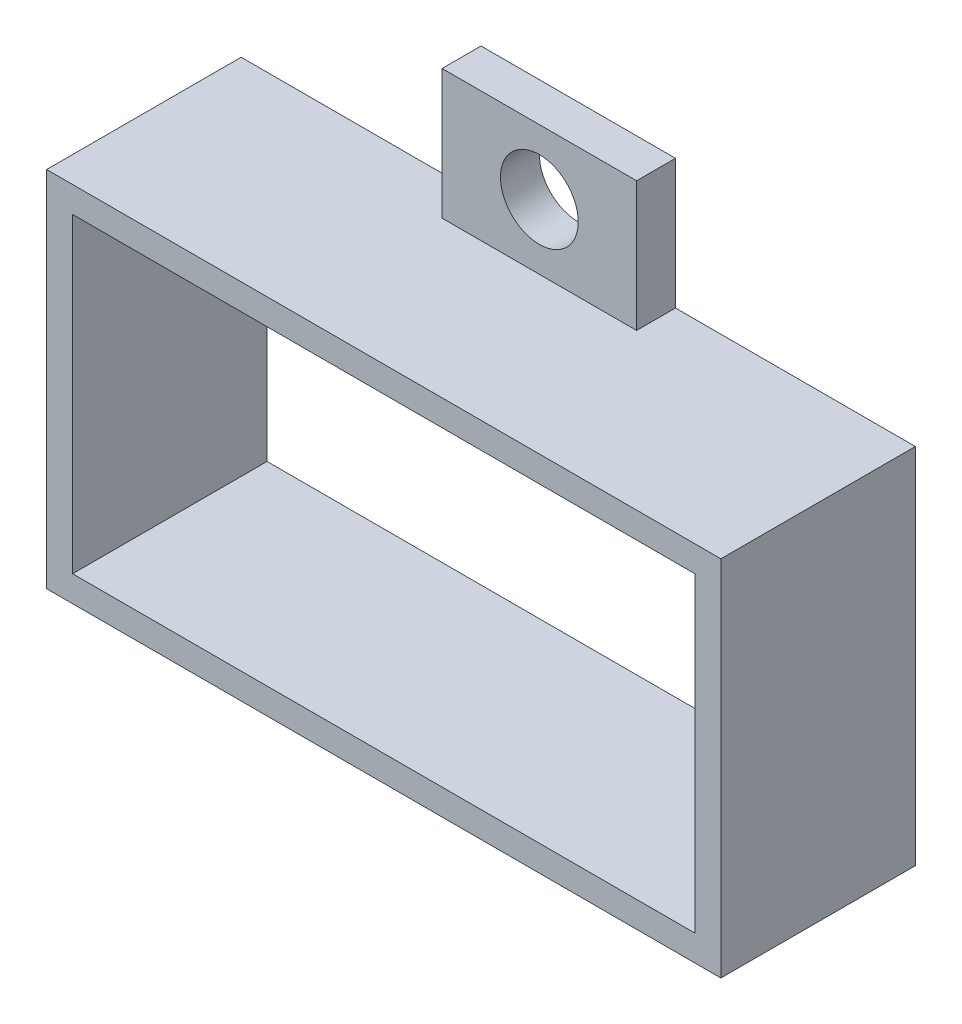
ISO-10303-21;
HEADER;
FILE_DESCRIPTION(('STEP AP214'),'2;1');
FILE_NAME('part.step','',(''),(''),'','','');
FILE_SCHEMA(('AUTOMOTIVE_DESIGN { 1 0 10303 214 1 1 1 1 }'));
ENDSEC;
DATA;
#1=APPLICATION_CONTEXT('core data for automotive mechanical design processes');
#2=APPLICATION_PROTOCOL_DEFINITION('international standard','automotive_design',2000,#1);
#3=PRODUCT_CONTEXT('',#1,'mechanical');
#4=PRODUCT('Part','Part','',(#3));
#5=PRODUCT_RELATED_PRODUCT_CATEGORY('part','',(#4));
#6=PRODUCT_DEFINITION_FORMATION('','',#4);
#7=PRODUCT_DEFINITION_CONTEXT('part definition',#1,'design');
#8=PRODUCT_DEFINITION('design','',#6,#7);
#9=PRODUCT_DEFINITION_SHAPE('','',#8);
#10=(LENGTH_UNIT() NAMED_UNIT(*) SI_UNIT(.MILLI.,.METRE.));
#11=(NAMED_UNIT(*) PLANE_ANGLE_UNIT() SI_UNIT($,.RADIAN.));
#12=(NAMED_UNIT(*) SI_UNIT($,.STERADIAN.) SOLID_ANGLE_UNIT());
#13=UNCERTAINTY_MEASURE_WITH_UNIT(LENGTH_MEASURE(1.E-05),#10,'distance_accuracy_value','');
#14=(GEOMETRIC_REPRESENTATION_CONTEXT(3) GLOBAL_UNCERTAINTY_ASSIGNED_CONTEXT((#13)) GLOBAL_UNIT_ASSIGNED_CONTEXT((#10,
#11,#12)) REPRESENTATION_CONTEXT('',''));
#15=CARTESIAN_POINT('',(0.,0.,0.));
#16=DIRECTION('',(0.,0.,1.));
#17=DIRECTION('',(1.,0.,0.));
#18=AXIS2_PLACEMENT_3D('',#15,#16,#17);
#19=CARTESIAN_POINT('',(-26.,14.,15.));
#20=DIRECTION('',(0.,-1.,0.));
#21=DIRECTION('',(0.,0.,-1.));
#22=AXIS2_PLACEMENT_3D('',#19,#20,#21);
#23=PLANE('',#22);
#24=DIRECTION('',(0.,0.,1.));
#25=VECTOR('',#24,1.);
#26=CARTESIAN_POINT('',(-7.5,14.,0.));
#27=LINE('',#26,#25);
#28=CARTESIAN_POINT('',(-7.50000000000001,14.,0.));
#29=VERTEX_POINT('',#28);
#30=CARTESIAN_POINT('',(-7.5,14.,3.));
#31=VERTEX_POINT('',#30);
#32=EDGE_CURVE('E194',#29,#31,#27,.T.);
#33=ORIENTED_EDGE('',*,*,#32,.F.);
#34=DIRECTION('',(-1.,0.,0.));
#35=VECTOR('',#34,1.);
#36=CARTESIAN_POINT('',(-26.,14.,0.));
#37=LINE('',#36,#35);
#38=CARTESIAN_POINT('',(-26.,14.,0.));
#39=VERTEX_POINT('',#38);
#40=EDGE_CURVE('E266',#29,#39,#37,.T.);
#41=ORIENTED_EDGE('',*,*,#40,.T.);
#42=DIRECTION('',(0.,0.,-1.));
#43=VECTOR('',#42,1.);
#44=CARTESIAN_POINT('',(-26.,14.,15.));
#45=LINE('',#44,#43);
#46=CARTESIAN_POINT('',(-26.,14.,15.));
#47=VERTEX_POINT('',#46);
#48=EDGE_CURVE('E40',#47,#39,#45,.T.);
#49=ORIENTED_EDGE('',*,*,#48,.F.);
#50=DIRECTION('',(-1.,0.,0.));
#51=VECTOR('',#50,1.);
#52=CARTESIAN_POINT('',(-26.,14.,15.));
#53=LINE('',#52,#51);
#54=CARTESIAN_POINT('',(26.,14.,15.));
#55=VERTEX_POINT('',#54);
#56=EDGE_CURVE('E256',#55,#47,#53,.T.);
#57=ORIENTED_EDGE('',*,*,#56,.F.);
#58=DIRECTION('',(0.,0.,-1.));
#59=VECTOR('',#58,1.);
#60=CARTESIAN_POINT('',(26.,14.,15.));
#61=LINE('',#60,#59);
#62=CARTESIAN_POINT('',(26.,14.,0.));
#63=VERTEX_POINT('',#62);
#64=EDGE_CURVE('E11',#55,#63,#61,.T.);
#65=ORIENTED_EDGE('',*,*,#64,.T.);
#66=CARTESIAN_POINT('',(7.49999999999999,14.,0.));
#67=VERTEX_POINT('',#66);
#68=EDGE_CURVE('E267',#63,#67,#37,.T.);
#69=ORIENTED_EDGE('',*,*,#68,.T.);
#70=DIRECTION('',(0.,0.,-1.));
#71=VECTOR('',#70,1.);
#72=CARTESIAN_POINT('',(7.5,14.,0.));
#73=LINE('',#72,#71);
#74=CARTESIAN_POINT('',(7.5,14.,3.));
#75=VERTEX_POINT('',#74);
#76=EDGE_CURVE('E199',#75,#67,#73,.T.);
#77=ORIENTED_EDGE('',*,*,#76,.F.);
#78=DIRECTION('',(1.,0.,0.));
#79=VECTOR('',#78,1.);
#80=CARTESIAN_POINT('',(-7.5,14.,3.));
#81=LINE('',#80,#79);
#82=EDGE_CURVE('E55',#31,#75,#81,.T.);
#83=ORIENTED_EDGE('',*,*,#82,.F.);
#84=EDGE_LOOP('',(#33,#41,#49,#57,#65,#69,#77,#83));
#85=FACE_BOUND('',#84,.T.);
#86=ADVANCED_FACE('F32',(#85),#23,.F.);
#87=CARTESIAN_POINT('',(0.,0.,15.));
#88=DIRECTION('',(0.,0.,1.));
#89=DIRECTION('',(1.,0.,0.));
#90=AXIS2_PLACEMENT_3D('',#87,#88,#89);
#91=PLANE('',#90);
#92=DIRECTION('',(0.,1.,0.));
#93=VECTOR('',#92,1.);
#94=CARTESIAN_POINT('',(26.,14.,15.));
#95=LINE('',#94,#93);
#96=CARTESIAN_POINT('',(26.,-14.,15.));
#97=VERTEX_POINT('',#96);
#98=EDGE_CURVE('E253',#97,#55,#95,.T.);
#99=ORIENTED_EDGE('',*,*,#98,.T.);
#100=ORIENTED_EDGE('',*,*,#56,.T.);
#101=DIRECTION('',(0.,-1.,0.));
#102=VECTOR('',#101,1.);
#103=CARTESIAN_POINT('',(-26.,14.,15.));
#104=LINE('',#103,#102);
#105=CARTESIAN_POINT('',(-26.,-14.,15.));
#106=VERTEX_POINT('',#105);
#107=EDGE_CURVE('E259',#47,#106,#104,.T.);
#108=ORIENTED_EDGE('',*,*,#107,.T.);
#109=DIRECTION('',(1.,0.,0.));
#110=VECTOR('',#109,1.);
#111=CARTESIAN_POINT('',(-26.,-14.,15.));
#112=LINE('',#111,#110);
#113=EDGE_CURVE('E261',#106,#97,#112,.T.);
#114=ORIENTED_EDGE('',*,*,#113,.T.);
#115=EDGE_LOOP('',(#99,#100,#108,#114));
#116=FACE_BOUND('',#115,.T.);
#117=DIRECTION('',(-1.,0.,0.));
#118=VECTOR('',#117,1.);
#119=CARTESIAN_POINT('',(-24.,12.,15.));
#120=LINE('',#119,#118);
#121=CARTESIAN_POINT('',(24.,12.,15.));
#122=VERTEX_POINT('',#121);
#123=CARTESIAN_POINT('',(-24.,12.,15.));
#124=VERTEX_POINT('',#123);
#125=EDGE_CURVE('E224',#122,#124,#120,.T.);
#126=ORIENTED_EDGE('',*,*,#125,.F.);
#127=DIRECTION('',(0.,1.,0.));
#128=VECTOR('',#127,1.);
#129=CARTESIAN_POINT('',(24.,12.,15.));
#130=LINE('',#129,#128);
#131=CARTESIAN_POINT('',(24.,-12.,15.));
#132=VERTEX_POINT('',#131);
#133=EDGE_CURVE('E222',#132,#122,#130,.T.);
#134=ORIENTED_EDGE('',*,*,#133,.F.);
#135=DIRECTION('',(1.,0.,0.));
#136=VECTOR('',#135,1.);
#137=CARTESIAN_POINT('',(-24.,-12.,15.));
#138=LINE('',#137,#136);
#139=CARTESIAN_POINT('',(-24.,-12.,15.));
#140=VERTEX_POINT('',#139);
#141=EDGE_CURVE('E230',#140,#132,#138,.T.);
#142=ORIENTED_EDGE('',*,*,#141,.F.);
#143=DIRECTION('',(0.,-1.,0.));
#144=VECTOR('',#143,1.);
#145=CARTESIAN_POINT('',(-24.,12.,15.));
#146=LINE('',#145,#144);
#147=EDGE_CURVE('E227',#124,#140,#146,.T.);
#148=ORIENTED_EDGE('',*,*,#147,.F.);
#149=EDGE_LOOP('',(#126,#134,#142,#148));
#150=FACE_BOUND('',#149,.T.);
#151=ADVANCED_FACE('F292',(#116,#150),#91,.T.);
#152=CARTESIAN_POINT('',(0.,0.,0.));
#153=DIRECTION('',(0.,0.,1.));
#154=DIRECTION('',(1.,0.,0.));
#155=AXIS2_PLACEMENT_3D('',#152,#153,#154);
#156=PLANE('',#155);
#157=CARTESIAN_POINT('',(0.,-19.,0.));
#158=DIRECTION('',(0.,0.,1.));
#159=DIRECTION('',(1.,0.,0.));
#160=AXIS2_PLACEMENT_3D('',#157,#158,#159);
#161=CIRCLE('',#160,3.);
#162=CARTESIAN_POINT('',(3.,-19.,0.));
#163=VERTEX_POINT('',#162);
#164=EDGE_CURVE('E181',#163,#163,#161,.F.);
#165=ORIENTED_EDGE('',*,*,#164,.F.);
#166=EDGE_LOOP('',(#165));
#167=FACE_BOUND('',#166,.T.);
#168=CARTESIAN_POINT('',(0.,19.,0.));
#169=DIRECTION('',(0.,0.,1.));
#170=DIRECTION('',(1.,0.,0.));
#171=AXIS2_PLACEMENT_3D('',#168,#169,#170);
#172=CIRCLE('',#171,3.);
#173=CARTESIAN_POINT('',(3.,19.,0.));
#174=VERTEX_POINT('',#173);
#175=EDGE_CURVE('E191',#174,#174,#172,.T.);
#176=ORIENTED_EDGE('',*,*,#175,.T.);
#177=EDGE_LOOP('',(#176));
#178=FACE_BOUND('',#177,.T.);
#179=DIRECTION('',(0.,1.,0.));
#180=VECTOR('',#179,1.);
#181=CARTESIAN_POINT('',(26.,14.,0.));
#182=LINE('',#181,#180);
#183=CARTESIAN_POINT('',(26.,-14.,0.));
#184=VERTEX_POINT('',#183);
#185=EDGE_CURVE('E252',#184,#63,#182,.T.);
#186=ORIENTED_EDGE('',*,*,#185,.F.);
#187=DIRECTION('',(1.,0.,0.));
#188=VECTOR('',#187,1.);
#189=CARTESIAN_POINT('',(-26.,-14.,0.));
#190=LINE('',#189,#188);
#191=CARTESIAN_POINT('',(7.49999999999999,-14.,0.));
#192=VERTEX_POINT('',#191);
#193=EDGE_CURVE('E271',#192,#184,#190,.T.);
#194=ORIENTED_EDGE('',*,*,#193,.F.);
#195=DIRECTION('',(0.,1.,0.));
#196=VECTOR('',#195,1.);
#197=CARTESIAN_POINT('',(7.5,-24.,0.));
#198=LINE('',#197,#196);
#199=CARTESIAN_POINT('',(7.5,-24.,0.));
#200=VERTEX_POINT('',#199);
#201=EDGE_CURVE('E47',#200,#192,#198,.T.);
#202=ORIENTED_EDGE('',*,*,#201,.F.);
#203=DIRECTION('',(-1.,0.,0.));
#204=VECTOR('',#203,1.);
#205=CARTESIAN_POINT('',(-7.5,-24.,0.));
#206=LINE('',#205,#204);
#207=CARTESIAN_POINT('',(-7.5,-24.,0.));
#208=VERTEX_POINT('',#207);
#209=EDGE_CURVE('E163',#200,#208,#206,.T.);
#210=ORIENTED_EDGE('',*,*,#209,.T.);
#211=DIRECTION('',(0.,1.,0.));
#212=VECTOR('',#211,1.);
#213=CARTESIAN_POINT('',(-7.5,-24.,0.));
#214=LINE('',#213,#212);
#215=CARTESIAN_POINT('',(-7.5,-14.,0.));
#216=VERTEX_POINT('',#215);
#217=EDGE_CURVE('E146',#208,#216,#214,.T.);
#218=ORIENTED_EDGE('',*,*,#217,.T.);
#219=CARTESIAN_POINT('',(-26.,-14.,0.));
#220=VERTEX_POINT('',#219);
#221=EDGE_CURVE('E257',#220,#216,#190,.T.);
#222=ORIENTED_EDGE('',*,*,#221,.F.);
#223=DIRECTION('',(0.,-1.,0.));
#224=VECTOR('',#223,1.);
#225=CARTESIAN_POINT('',(-26.,14.,0.));
#226=LINE('',#225,#224);
#227=EDGE_CURVE('E269',#39,#220,#226,.T.);
#228=ORIENTED_EDGE('',*,*,#227,.F.);
#229=ORIENTED_EDGE('',*,*,#40,.F.);
#230=DIRECTION('',(0.,-1.,0.));
#231=VECTOR('',#230,1.);
#232=CARTESIAN_POINT('',(-7.5,24.,0.));
#233=LINE('',#232,#231);
#234=CARTESIAN_POINT('',(-7.5,24.,0.));
#235=VERTEX_POINT('',#234);
#236=EDGE_CURVE('E205',#235,#29,#233,.T.);
#237=ORIENTED_EDGE('',*,*,#236,.F.);
#238=DIRECTION('',(-1.,0.,0.));
#239=VECTOR('',#238,1.);
#240=CARTESIAN_POINT('',(-7.5,24.,0.));
#241=LINE('',#240,#239);
#242=CARTESIAN_POINT('',(7.5,24.,0.));
#243=VERTEX_POINT('',#242);
#244=EDGE_CURVE('E203',#243,#235,#241,.T.);
#245=ORIENTED_EDGE('',*,*,#244,.F.);
#246=DIRECTION('',(0.,-1.,0.));
#247=VECTOR('',#246,1.);
#248=CARTESIAN_POINT('',(7.5,24.,0.));
#249=LINE('',#248,#247);
#250=EDGE_CURVE('E213',#243,#67,#249,.T.);
#251=ORIENTED_EDGE('',*,*,#250,.T.);
#252=ORIENTED_EDGE('',*,*,#68,.F.);
#253=EDGE_LOOP('',(#186,#194,#202,#210,#218,#222,#228,#229,#237,#245,#251,#252));
#254=FACE_BOUND('',#253,.T.);
#255=DIRECTION('',(0.,1.,0.));
#256=VECTOR('',#255,1.);
#257=CARTESIAN_POINT('',(24.,12.,0.));
#258=LINE('',#257,#256);
#259=CARTESIAN_POINT('',(24.,-12.,0.));
#260=VERTEX_POINT('',#259);
#261=CARTESIAN_POINT('',(24.,12.,0.));
#262=VERTEX_POINT('',#261);
#263=EDGE_CURVE('E221',#260,#262,#258,.T.);
#264=ORIENTED_EDGE('',*,*,#263,.T.);
#265=DIRECTION('',(-1.,0.,0.));
#266=VECTOR('',#265,1.);
#267=CARTESIAN_POINT('',(-24.,12.,0.));
#268=LINE('',#267,#266);
#269=CARTESIAN_POINT('',(-24.,12.,0.));
#270=VERTEX_POINT('',#269);
#271=EDGE_CURVE('E235',#262,#270,#268,.T.);
#272=ORIENTED_EDGE('',*,*,#271,.T.);
#273=DIRECTION('',(0.,-1.,0.));
#274=VECTOR('',#273,1.);
#275=CARTESIAN_POINT('',(-24.,12.,0.));
#276=LINE('',#275,#274);
#277=CARTESIAN_POINT('',(-24.,-12.,0.));
#278=VERTEX_POINT('',#277);
#279=EDGE_CURVE('E238',#270,#278,#276,.T.);
#280=ORIENTED_EDGE('',*,*,#279,.T.);
#281=DIRECTION('',(1.,0.,0.));
#282=VECTOR('',#281,1.);
#283=CARTESIAN_POINT('',(-24.,-12.,0.));
#284=LINE('',#283,#282);
#285=EDGE_CURVE('E225',#278,#260,#284,.T.);
#286=ORIENTED_EDGE('',*,*,#285,.T.);
#287=EDGE_LOOP('',(#264,#272,#280,#286));
#288=FACE_BOUND('',#287,.T.);
#289=ADVANCED_FACE('F169',(#167,#178,#254,#288),#156,.F.);
#290=CARTESIAN_POINT('',(26.,14.,15.));
#291=DIRECTION('',(-1.,0.,0.));
#292=DIRECTION('',(0.,-1.,0.));
#293=AXIS2_PLACEMENT_3D('',#290,#291,#292);
#294=PLANE('',#293);
#295=ORIENTED_EDGE('',*,*,#185,.T.);
#296=ORIENTED_EDGE('',*,*,#64,.F.);
#297=ORIENTED_EDGE('',*,*,#98,.F.);
#298=DIRECTION('',(0.,0.,-1.));
#299=VECTOR('',#298,1.);
#300=CARTESIAN_POINT('',(26.,-14.,15.));
#301=LINE('',#300,#299);
#302=EDGE_CURVE('E263',#97,#184,#301,.T.);
#303=ORIENTED_EDGE('',*,*,#302,.T.);
#304=EDGE_LOOP('',(#295,#296,#297,#303));
#305=FACE_BOUND('',#304,.T.);
#306=ADVANCED_FACE('F34',(#305),#294,.F.);
#307=CARTESIAN_POINT('',(-26.,14.,15.));
#308=DIRECTION('',(1.,0.,0.));
#309=DIRECTION('',(0.,1.,0.));
#310=AXIS2_PLACEMENT_3D('',#307,#308,#309);
#311=PLANE('',#310);
#312=ORIENTED_EDGE('',*,*,#227,.T.);
#313=DIRECTION('',(0.,0.,-1.));
#314=VECTOR('',#313,1.);
#315=CARTESIAN_POINT('',(-26.,-14.,15.));
#316=LINE('',#315,#314);
#317=EDGE_CURVE('E275',#106,#220,#316,.T.);
#318=ORIENTED_EDGE('',*,*,#317,.F.);
#319=ORIENTED_EDGE('',*,*,#107,.F.);
#320=ORIENTED_EDGE('',*,*,#48,.T.);
#321=EDGE_LOOP('',(#312,#318,#319,#320));
#322=FACE_BOUND('',#321,.T.);
#323=ADVANCED_FACE('F282',(#322),#311,.F.);
#324=CARTESIAN_POINT('',(-26.,-14.,15.));
#325=DIRECTION('',(0.,1.,0.));
#326=DIRECTION('',(0.,0.,1.));
#327=AXIS2_PLACEMENT_3D('',#324,#325,#326);
#328=PLANE('',#327);
#329=ORIENTED_EDGE('',*,*,#221,.T.);
#330=DIRECTION('',(0.,0.,1.));
#331=VECTOR('',#330,1.);
#332=CARTESIAN_POINT('',(-7.5,-14.,0.));
#333=LINE('',#332,#331);
#334=CARTESIAN_POINT('',(-7.5,-14.,3.));
#335=VERTEX_POINT('',#334);
#336=EDGE_CURVE('E152',#216,#335,#333,.T.);
#337=ORIENTED_EDGE('',*,*,#336,.T.);
#338=DIRECTION('',(1.,0.,0.));
#339=VECTOR('',#338,1.);
#340=CARTESIAN_POINT('',(-7.5,-14.,3.));
#341=LINE('',#340,#339);
#342=CARTESIAN_POINT('',(7.5,-14.,3.));
#343=VERTEX_POINT('',#342);
#344=EDGE_CURVE('E166',#335,#343,#341,.T.);
#345=ORIENTED_EDGE('',*,*,#344,.T.);
#346=DIRECTION('',(0.,0.,-1.));
#347=VECTOR('',#346,1.);
#348=CARTESIAN_POINT('',(7.5,-14.,0.));
#349=LINE('',#348,#347);
#350=EDGE_CURVE('E180',#343,#192,#349,.T.);
#351=ORIENTED_EDGE('',*,*,#350,.T.);
#352=ORIENTED_EDGE('',*,*,#193,.T.);
#353=ORIENTED_EDGE('',*,*,#302,.F.);
#354=ORIENTED_EDGE('',*,*,#113,.F.);
#355=ORIENTED_EDGE('',*,*,#317,.T.);
#356=EDGE_LOOP('',(#329,#337,#345,#351,#352,#353,#354,#355));
#357=FACE_BOUND('',#356,.T.);
#358=ADVANCED_FACE('F287',(#357),#328,.F.);
#359=CARTESIAN_POINT('',(24.,12.,15.));
#360=DIRECTION('',(-1.,0.,0.));
#361=DIRECTION('',(0.,-1.,0.));
#362=AXIS2_PLACEMENT_3D('',#359,#360,#361);
#363=PLANE('',#362);
#364=ORIENTED_EDGE('',*,*,#263,.F.);
#365=DIRECTION('',(0.,0.,-1.));
#366=VECTOR('',#365,1.);
#367=CARTESIAN_POINT('',(24.,-12.,15.));
#368=LINE('',#367,#366);
#369=EDGE_CURVE('E232',#132,#260,#368,.T.);
#370=ORIENTED_EDGE('',*,*,#369,.F.);
#371=ORIENTED_EDGE('',*,*,#133,.T.);
#372=DIRECTION('',(0.,0.,-1.));
#373=VECTOR('',#372,1.);
#374=CARTESIAN_POINT('',(24.,12.,15.));
#375=LINE('',#374,#373);
#376=EDGE_CURVE('E249',#122,#262,#375,.T.);
#377=ORIENTED_EDGE('',*,*,#376,.T.);
#378=EDGE_LOOP('',(#364,#370,#371,#377));
#379=FACE_BOUND('',#378,.T.);
#380=ADVANCED_FACE('F330',(#379),#363,.T.);
#381=CARTESIAN_POINT('',(-24.,12.,15.));
#382=DIRECTION('',(0.,-1.,0.));
#383=DIRECTION('',(0.,0.,-1.));
#384=AXIS2_PLACEMENT_3D('',#381,#382,#383);
#385=PLANE('',#384);
#386=ORIENTED_EDGE('',*,*,#271,.F.);
#387=ORIENTED_EDGE('',*,*,#376,.F.);
#388=ORIENTED_EDGE('',*,*,#125,.T.);
#389=DIRECTION('',(0.,0.,-1.));
#390=VECTOR('',#389,1.);
#391=CARTESIAN_POINT('',(-24.,12.,15.));
#392=LINE('',#391,#390);
#393=EDGE_CURVE('E247',#124,#270,#392,.T.);
#394=ORIENTED_EDGE('',*,*,#393,.T.);
#395=EDGE_LOOP('',(#386,#387,#388,#394));
#396=FACE_BOUND('',#395,.T.);
#397=ADVANCED_FACE('F336',(#396),#385,.T.);
#398=CARTESIAN_POINT('',(-24.,12.,15.));
#399=DIRECTION('',(1.,0.,0.));
#400=DIRECTION('',(0.,1.,0.));
#401=AXIS2_PLACEMENT_3D('',#398,#399,#400);
#402=PLANE('',#401);
#403=ORIENTED_EDGE('',*,*,#279,.F.);
#404=ORIENTED_EDGE('',*,*,#393,.F.);
#405=ORIENTED_EDGE('',*,*,#147,.T.);
#406=DIRECTION('',(0.,0.,-1.));
#407=VECTOR('',#406,1.);
#408=CARTESIAN_POINT('',(-24.,-12.,15.));
#409=LINE('',#408,#407);
#410=EDGE_CURVE('E245',#140,#278,#409,.T.);
#411=ORIENTED_EDGE('',*,*,#410,.T.);
#412=EDGE_LOOP('',(#403,#404,#405,#411));
#413=FACE_BOUND('',#412,.T.);
#414=ADVANCED_FACE('F340',(#413),#402,.T.);
#415=CARTESIAN_POINT('',(-24.,-12.,15.));
#416=DIRECTION('',(0.,1.,0.));
#417=DIRECTION('',(0.,0.,1.));
#418=AXIS2_PLACEMENT_3D('',#415,#416,#417);
#419=PLANE('',#418);
#420=ORIENTED_EDGE('',*,*,#285,.F.);
#421=ORIENTED_EDGE('',*,*,#410,.F.);
#422=ORIENTED_EDGE('',*,*,#141,.T.);
#423=ORIENTED_EDGE('',*,*,#369,.T.);
#424=EDGE_LOOP('',(#420,#421,#422,#423));
#425=FACE_BOUND('',#424,.T.);
#426=ADVANCED_FACE('F344',(#425),#419,.T.);
#427=CARTESIAN_POINT('',(-7.5,24.,0.));
#428=DIRECTION('',(1.,0.,0.));
#429=DIRECTION('',(0.,0.,-1.));
#430=AXIS2_PLACEMENT_3D('',#427,#428,#429);
#431=PLANE('',#430);
#432=ORIENTED_EDGE('',*,*,#32,.T.);
#433=DIRECTION('',(0.,-1.,0.));
#434=VECTOR('',#433,1.);
#435=CARTESIAN_POINT('',(-7.5,24.,3.));
#436=LINE('',#435,#434);
#437=CARTESIAN_POINT('',(-7.5,24.,3.));
#438=VERTEX_POINT('',#437);
#439=EDGE_CURVE('E219',#438,#31,#436,.T.);
#440=ORIENTED_EDGE('',*,*,#439,.F.);
#441=DIRECTION('',(0.,0.,1.));
#442=VECTOR('',#441,1.);
#443=CARTESIAN_POINT('',(-7.5,24.,0.));
#444=LINE('',#443,#442);
#445=EDGE_CURVE('E195',#235,#438,#444,.T.);
#446=ORIENTED_EDGE('',*,*,#445,.F.);
#447=ORIENTED_EDGE('',*,*,#236,.T.);
#448=EDGE_LOOP('',(#432,#440,#446,#447));
#449=FACE_BOUND('',#448,.T.);
#450=ADVANCED_FACE('F307',(#449),#431,.F.);
#451=CARTESIAN_POINT('',(-7.5,24.,3.));
#452=DIRECTION('',(0.,0.,-1.));
#453=DIRECTION('',(-1.,0.,0.));
#454=AXIS2_PLACEMENT_3D('',#451,#452,#453);
#455=PLANE('',#454);
#456=CARTESIAN_POINT('',(0.,19.,3.));
#457=DIRECTION('',(0.,0.,1.));
#458=DIRECTION('',(1.,0.,0.));
#459=AXIS2_PLACEMENT_3D('',#456,#457,#458);
#460=CIRCLE('',#459,3.);
#461=CARTESIAN_POINT('',(3.,19.,3.));
#462=VERTEX_POINT('',#461);
#463=EDGE_CURVE('E157',#462,#462,#460,.T.);
#464=ORIENTED_EDGE('',*,*,#463,.F.);
#465=EDGE_LOOP('',(#464));
#466=FACE_BOUND('',#465,.T.);
#467=ORIENTED_EDGE('',*,*,#82,.T.);
#468=DIRECTION('',(0.,-1.,0.));
#469=VECTOR('',#468,1.);
#470=CARTESIAN_POINT('',(7.5,24.,3.));
#471=LINE('',#470,#469);
#472=CARTESIAN_POINT('',(7.5,24.,3.));
#473=VERTEX_POINT('',#472);
#474=EDGE_CURVE('E216',#473,#75,#471,.T.);
#475=ORIENTED_EDGE('',*,*,#474,.F.);
#476=DIRECTION('',(1.,0.,0.));
#477=VECTOR('',#476,1.);
#478=CARTESIAN_POINT('',(-7.5,24.,3.));
#479=LINE('',#478,#477);
#480=EDGE_CURVE('E198',#438,#473,#479,.T.);
#481=ORIENTED_EDGE('',*,*,#480,.F.);
#482=ORIENTED_EDGE('',*,*,#439,.T.);
#483=EDGE_LOOP('',(#467,#475,#481,#482));
#484=FACE_BOUND('',#483,.T.);
#485=ADVANCED_FACE('F303',(#466,#484),#455,.F.);
#486=CARTESIAN_POINT('',(7.5,24.,0.));
#487=DIRECTION('',(-1.,0.,0.));
#488=DIRECTION('',(0.,0.,1.));
#489=AXIS2_PLACEMENT_3D('',#486,#487,#488);
#490=PLANE('',#489);
#491=ORIENTED_EDGE('',*,*,#76,.T.);
#492=ORIENTED_EDGE('',*,*,#250,.F.);
#493=DIRECTION('',(0.,0.,-1.));
#494=VECTOR('',#493,1.);
#495=CARTESIAN_POINT('',(7.5,24.,0.));
#496=LINE('',#495,#494);
#497=EDGE_CURVE('E201',#473,#243,#496,.T.);
#498=ORIENTED_EDGE('',*,*,#497,.F.);
#499=ORIENTED_EDGE('',*,*,#474,.T.);
#500=EDGE_LOOP('',(#491,#492,#498,#499));
#501=FACE_BOUND('',#500,.T.);
#502=ADVANCED_FACE('F300',(#501),#490,.F.);
#503=CARTESIAN_POINT('',(0.,24.,0.));
#504=DIRECTION('',(0.,1.,0.));
#505=DIRECTION('',(0.,0.,1.));
#506=AXIS2_PLACEMENT_3D('',#503,#504,#505);
#507=PLANE('',#506);
#508=ORIENTED_EDGE('',*,*,#445,.T.);
#509=ORIENTED_EDGE('',*,*,#480,.T.);
#510=ORIENTED_EDGE('',*,*,#497,.T.);
#511=ORIENTED_EDGE('',*,*,#244,.T.);
#512=EDGE_LOOP('',(#508,#509,#510,#511));
#513=FACE_BOUND('',#512,.T.);
#514=ADVANCED_FACE('F309',(#513),#507,.T.);
#515=CARTESIAN_POINT('',(0.,19.,-7.));
#516=DIRECTION('',(0.,0.,1.));
#517=DIRECTION('',(1.,0.,0.));
#518=AXIS2_PLACEMENT_3D('',#515,#516,#517);
#519=CYLINDRICAL_SURFACE('',#518,3.);
#520=ORIENTED_EDGE('',*,*,#463,.T.);
#521=EDGE_LOOP('',(#520));
#522=FACE_BOUND('',#521,.T.);
#523=ORIENTED_EDGE('',*,*,#175,.F.);
#524=EDGE_LOOP('',(#523));
#525=FACE_BOUND('',#524,.T.);
#526=ADVANCED_FACE('F311',(#522,#525),#519,.F.);
#527=CARTESIAN_POINT('',(-7.5,-24.,0.));
#528=DIRECTION('',(-1.,0.,0.));
#529=DIRECTION('',(0.,0.,1.));
#530=AXIS2_PLACEMENT_3D('',#527,#528,#529);
#531=PLANE('',#530);
#532=ORIENTED_EDGE('',*,*,#336,.F.);
#533=ORIENTED_EDGE('',*,*,#217,.F.);
#534=DIRECTION('',(0.,0.,1.));
#535=VECTOR('',#534,1.);
#536=CARTESIAN_POINT('',(-7.5,-24.,0.));
#537=LINE('',#536,#535);
#538=CARTESIAN_POINT('',(-7.5,-24.,3.));
#539=VERTEX_POINT('',#538);
#540=EDGE_CURVE('E149',#208,#539,#537,.T.);
#541=ORIENTED_EDGE('',*,*,#540,.T.);
#542=DIRECTION('',(0.,1.,0.));
#543=VECTOR('',#542,1.);
#544=CARTESIAN_POINT('',(-7.5,-24.,3.));
#545=LINE('',#544,#543);
#546=EDGE_CURVE('E178',#539,#335,#545,.T.);
#547=ORIENTED_EDGE('',*,*,#546,.T.);
#548=EDGE_LOOP('',(#532,#533,#541,#547));
#549=FACE_BOUND('',#548,.T.);
#550=ADVANCED_FACE('F148',(#549),#531,.T.);
#551=CARTESIAN_POINT('',(7.5,-24.,0.));
#552=DIRECTION('',(1.,0.,0.));
#553=DIRECTION('',(0.,0.,-1.));
#554=AXIS2_PLACEMENT_3D('',#551,#552,#553);
#555=PLANE('',#554);
#556=ORIENTED_EDGE('',*,*,#350,.F.);
#557=DIRECTION('',(0.,1.,0.));
#558=VECTOR('',#557,1.);
#559=CARTESIAN_POINT('',(7.5,-24.,3.));
#560=LINE('',#559,#558);
#561=CARTESIAN_POINT('',(7.5,-24.,3.));
#562=VERTEX_POINT('',#561);
#563=EDGE_CURVE('E186',#562,#343,#560,.T.);
#564=ORIENTED_EDGE('',*,*,#563,.F.);
#565=DIRECTION('',(0.,0.,-1.));
#566=VECTOR('',#565,1.);
#567=CARTESIAN_POINT('',(7.5,-24.,0.));
#568=LINE('',#567,#566);
#569=EDGE_CURVE('E172',#562,#200,#568,.T.);
#570=ORIENTED_EDGE('',*,*,#569,.T.);
#571=ORIENTED_EDGE('',*,*,#201,.T.);
#572=EDGE_LOOP('',(#556,#564,#570,#571));
#573=FACE_BOUND('',#572,.T.);
#574=ADVANCED_FACE('F397',(#573),#555,.T.);
#575=CARTESIAN_POINT('',(-7.5,-24.,3.));
#576=DIRECTION('',(0.,0.,1.));
#577=DIRECTION('',(1.,0.,0.));
#578=AXIS2_PLACEMENT_3D('',#575,#576,#577);
#579=PLANE('',#578);
#580=CARTESIAN_POINT('',(0.,-19.,3.));
#581=DIRECTION('',(0.,0.,-1.));
#582=DIRECTION('',(1.,0.,0.));
#583=AXIS2_PLACEMENT_3D('',#580,#581,#582);
#584=CIRCLE('',#583,3.);
#585=CARTESIAN_POINT('',(3.,-19.,3.));
#586=VERTEX_POINT('',#585);
#587=EDGE_CURVE('E440',#586,#586,#584,.T.);
#588=ORIENTED_EDGE('',*,*,#587,.T.);
#589=EDGE_LOOP('',(#588));
#590=FACE_BOUND('',#589,.T.);
#591=ORIENTED_EDGE('',*,*,#344,.F.);
#592=ORIENTED_EDGE('',*,*,#546,.F.);
#593=DIRECTION('',(1.,0.,0.));
#594=VECTOR('',#593,1.);
#595=CARTESIAN_POINT('',(-7.5,-24.,3.));
#596=LINE('',#595,#594);
#597=EDGE_CURVE('E165',#539,#562,#596,.T.);
#598=ORIENTED_EDGE('',*,*,#597,.T.);
#599=ORIENTED_EDGE('',*,*,#563,.T.);
#600=EDGE_LOOP('',(#591,#592,#598,#599));
#601=FACE_BOUND('',#600,.T.);
#602=ADVANCED_FACE('F405',(#590,#601),#579,.T.);
#603=CARTESIAN_POINT('',(0.,-24.,0.));
#604=DIRECTION('',(0.,-1.,0.));
#605=DIRECTION('',(0.,0.,1.));
#606=AXIS2_PLACEMENT_3D('',#603,#604,#605);
#607=PLANE('',#606);
#608=ORIENTED_EDGE('',*,*,#540,.F.);
#609=ORIENTED_EDGE('',*,*,#209,.F.);
#610=ORIENTED_EDGE('',*,*,#569,.F.);
#611=ORIENTED_EDGE('',*,*,#597,.F.);
#612=EDGE_LOOP('',(#608,#609,#610,#611));
#613=FACE_BOUND('',#612,.T.);
#614=ADVANCED_FACE('F161',(#613),#607,.T.);
#615=CARTESIAN_POINT('',(0.,-19.,-7.));
#616=DIRECTION('',(0.,0.,1.));
#617=DIRECTION('',(1.,0.,0.));
#618=AXIS2_PLACEMENT_3D('',#615,#616,#617);
#619=CYLINDRICAL_SURFACE('',#618,3.);
#620=ORIENTED_EDGE('',*,*,#587,.F.);
#621=EDGE_LOOP('',(#620));
#622=FACE_BOUND('',#621,.T.);
#623=ORIENTED_EDGE('',*,*,#164,.T.);
#624=EDGE_LOOP('',(#623));
#625=FACE_BOUND('',#624,.T.);
#626=ADVANCED_FACE('F421',(#622,#625),#619,.F.);
#627=CLOSED_SHELL('',(#86,#151,#289,#306,#323,#358,#380,#397,#414,#426,#450,#485,#502,#514,#526,
#550,#574,#602,#614,#626));
#628=MANIFOLD_SOLID_BREP('B2',#627);
#629=ADVANCED_BREP_SHAPE_REPRESENTATION('',(#18,#628),#14);
#630=SHAPE_DEFINITION_REPRESENTATION(#9,#629);
ENDSEC;
END-ISO-10303-21;
